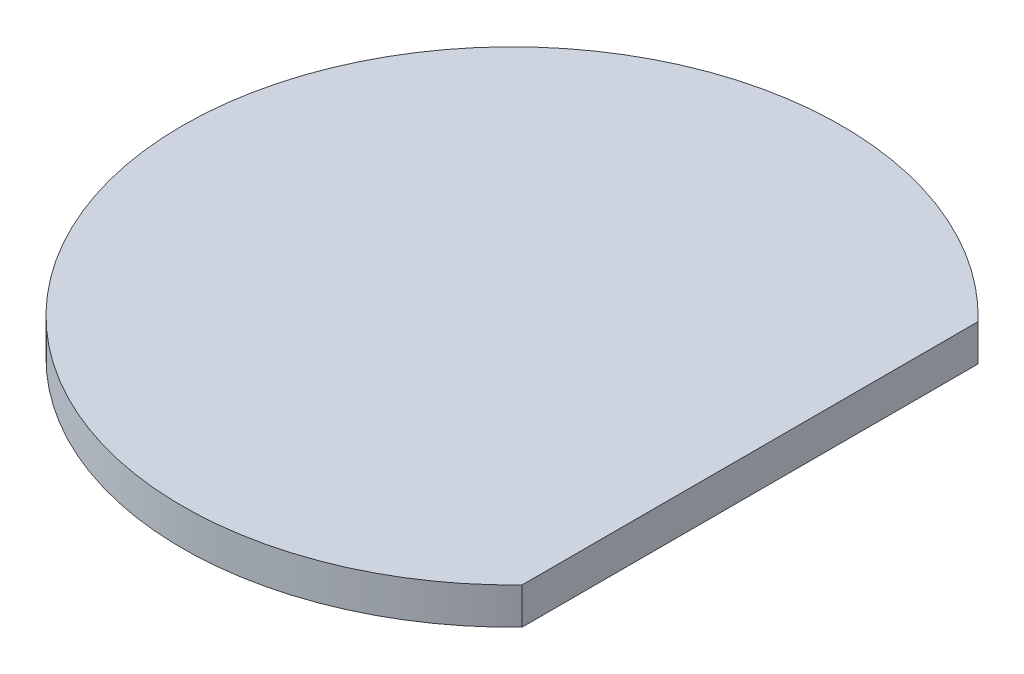
ISO-10303-21;
HEADER;
FILE_DESCRIPTION(('STEP AP214'),'2;1');
FILE_NAME('part.step','',(''),(''),'','','');
FILE_SCHEMA(('AUTOMOTIVE_DESIGN { 1 0 10303 214 1 1 1 1 }'));
ENDSEC;
DATA;
#1=APPLICATION_CONTEXT('core data for automotive mechanical design processes');
#2=APPLICATION_PROTOCOL_DEFINITION('international standard','automotive_design',2000,#1);
#3=PRODUCT_CONTEXT('',#1,'mechanical');
#4=PRODUCT('Part','Part','',(#3));
#5=PRODUCT_RELATED_PRODUCT_CATEGORY('part','',(#4));
#6=PRODUCT_DEFINITION_FORMATION('','',#4);
#7=PRODUCT_DEFINITION_CONTEXT('part definition',#1,'design');
#8=PRODUCT_DEFINITION('design','',#6,#7);
#9=PRODUCT_DEFINITION_SHAPE('','',#8);
#10=(LENGTH_UNIT() NAMED_UNIT(*) SI_UNIT(.MILLI.,.METRE.));
#11=(NAMED_UNIT(*) PLANE_ANGLE_UNIT() SI_UNIT($,.RADIAN.));
#12=(NAMED_UNIT(*) SI_UNIT($,.STERADIAN.) SOLID_ANGLE_UNIT());
#13=UNCERTAINTY_MEASURE_WITH_UNIT(LENGTH_MEASURE(1.E-05),#10,'distance_accuracy_value','');
#14=(GEOMETRIC_REPRESENTATION_CONTEXT(3) GLOBAL_UNCERTAINTY_ASSIGNED_CONTEXT((#13)) GLOBAL_UNIT_ASSIGNED_CONTEXT((#10,
#11,#12)) REPRESENTATION_CONTEXT('',''));
#15=CARTESIAN_POINT('',(0.,0.,0.));
#16=DIRECTION('',(0.,0.,1.));
#17=DIRECTION('',(1.,0.,0.));
#18=AXIS2_PLACEMENT_3D('',#15,#16,#17);
#19=CARTESIAN_POINT('',(6.5,1.,0.));
#20=DIRECTION('',(1.,0.,0.));
#21=DIRECTION('',(0.,0.,-1.));
#22=AXIS2_PLACEMENT_3D('',#19,#20,#21);
#23=PLANE('',#22);
#24=DIRECTION('',(0.,0.,1.));
#25=VECTOR('',#24,1.);
#26=CARTESIAN_POINT('',(6.5,0.,0.));
#27=LINE('',#26,#25);
#28=CARTESIAN_POINT('',(6.5,0.,-6.22494979899436));
#29=VERTEX_POINT('',#28);
#30=CARTESIAN_POINT('',(6.5,0.,6.22494979899436));
#31=VERTEX_POINT('',#30);
#32=EDGE_CURVE('E61',#29,#31,#27,.T.);
#33=ORIENTED_EDGE('',*,*,#32,.F.);
#34=DIRECTION('',(0.,-1.,0.));
#35=VECTOR('',#34,1.);
#36=CARTESIAN_POINT('',(6.5,1.,-6.22494979899436));
#37=LINE('',#36,#35);
#38=CARTESIAN_POINT('',(6.5,1.,-6.22494979899436));
#39=VERTEX_POINT('',#38);
#40=EDGE_CURVE('E11',#39,#29,#37,.T.);
#41=ORIENTED_EDGE('',*,*,#40,.F.);
#42=DIRECTION('',(0.,0.,1.));
#43=VECTOR('',#42,1.);
#44=CARTESIAN_POINT('',(6.5,1.,0.));
#45=LINE('',#44,#43);
#46=CARTESIAN_POINT('',(6.5,1.,6.22494979899436));
#47=VERTEX_POINT('',#46);
#48=EDGE_CURVE('E62',#39,#47,#45,.T.);
#49=ORIENTED_EDGE('',*,*,#48,.T.);
#50=DIRECTION('',(0.,-1.,0.));
#51=VECTOR('',#50,1.);
#52=CARTESIAN_POINT('',(6.5,1.,6.22494979899436));
#53=LINE('',#52,#51);
#54=EDGE_CURVE('E41',#47,#31,#53,.T.);
#55=ORIENTED_EDGE('',*,*,#54,.T.);
#56=EDGE_LOOP('',(#33,#41,#49,#55));
#57=FACE_BOUND('',#56,.T.);
#58=ADVANCED_FACE('F33',(#57),#23,.T.);
#59=CARTESIAN_POINT('',(0.,1.,0.));
#60=DIRECTION('',(0.,-1.,0.));
#61=DIRECTION('',(0.,0.,-1.));
#62=AXIS2_PLACEMENT_3D('',#59,#60,#61);
#63=CYLINDRICAL_SURFACE('',#62,9.);
#64=CARTESIAN_POINT('',(0.,0.,0.));
#65=DIRECTION('',(0.,1.,0.));
#66=DIRECTION('',(0.,0.,1.));
#67=AXIS2_PLACEMENT_3D('',#64,#65,#66);
#68=CIRCLE('',#67,9.);
#69=EDGE_CURVE('E63',#29,#31,#68,.T.);
#70=ORIENTED_EDGE('',*,*,#69,.T.);
#71=ORIENTED_EDGE('',*,*,#54,.F.);
#72=CARTESIAN_POINT('',(0.,1.,0.));
#73=DIRECTION('',(0.,1.,0.));
#74=DIRECTION('',(0.,0.,1.));
#75=AXIS2_PLACEMENT_3D('',#72,#73,#74);
#76=CIRCLE('',#75,9.);
#77=EDGE_CURVE('E48',#39,#47,#76,.T.);
#78=ORIENTED_EDGE('',*,*,#77,.F.);
#79=ORIENTED_EDGE('',*,*,#40,.T.);
#80=EDGE_LOOP('',(#70,#71,#78,#79));
#81=FACE_BOUND('',#80,.T.);
#82=ADVANCED_FACE('F64',(#81),#63,.T.);
#83=CARTESIAN_POINT('',(0.,1.,0.));
#84=DIRECTION('',(0.,1.,0.));
#85=DIRECTION('',(0.,0.,1.));
#86=AXIS2_PLACEMENT_3D('',#83,#84,#85);
#87=PLANE('',#86);
#88=ORIENTED_EDGE('',*,*,#48,.F.);
#89=ORIENTED_EDGE('',*,*,#77,.T.);
#90=EDGE_LOOP('',(#88,#89));
#91=FACE_BOUND('',#90,.T.);
#92=ADVANCED_FACE('F72',(#91),#87,.T.);
#93=CARTESIAN_POINT('',(0.,0.,0.));
#94=DIRECTION('',(0.,1.,0.));
#95=DIRECTION('',(0.,0.,1.));
#96=AXIS2_PLACEMENT_3D('',#93,#94,#95);
#97=PLANE('',#96);
#98=ORIENTED_EDGE('',*,*,#32,.T.);
#99=ORIENTED_EDGE('',*,*,#69,.F.);
#100=EDGE_LOOP('',(#98,#99));
#101=FACE_BOUND('',#100,.T.);
#102=ADVANCED_FACE('F67',(#101),#97,.F.);
#103=CLOSED_SHELL('',(#58,#82,#92,#102));
#104=MANIFOLD_SOLID_BREP('B2',#103);
#105=ADVANCED_BREP_SHAPE_REPRESENTATION('',(#18,#104),#14);
#106=SHAPE_DEFINITION_REPRESENTATION(#9,#105);
ENDSEC;
END-ISO-10303-21;
